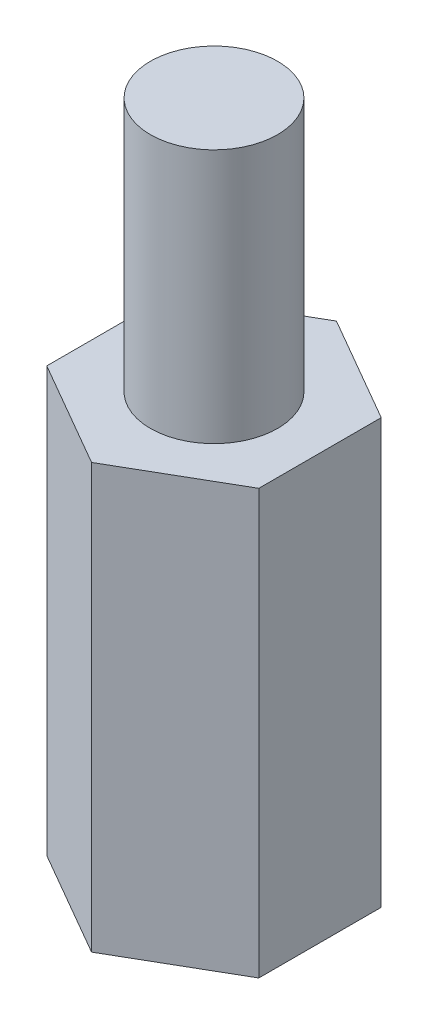
ISO-10303-21;
HEADER;
FILE_DESCRIPTION(('STEP AP214'),'2;1');
FILE_NAME('part.step','',(''),(''),'','','');
FILE_SCHEMA(('AUTOMOTIVE_DESIGN { 1 0 10303 214 1 1 1 1 }'));
ENDSEC;
DATA;
#1=APPLICATION_CONTEXT('core data for automotive mechanical design processes');
#2=APPLICATION_PROTOCOL_DEFINITION('international standard','automotive_design',2000,#1);
#3=PRODUCT_CONTEXT('',#1,'mechanical');
#4=PRODUCT('Part','Part','',(#3));
#5=PRODUCT_RELATED_PRODUCT_CATEGORY('part','',(#4));
#6=PRODUCT_DEFINITION_FORMATION('','',#4);
#7=PRODUCT_DEFINITION_CONTEXT('part definition',#1,'design');
#8=PRODUCT_DEFINITION('design','',#6,#7);
#9=PRODUCT_DEFINITION_SHAPE('','',#8);
#10=(LENGTH_UNIT() NAMED_UNIT(*) SI_UNIT(.MILLI.,.METRE.));
#11=(NAMED_UNIT(*) PLANE_ANGLE_UNIT() SI_UNIT($,.RADIAN.));
#12=(NAMED_UNIT(*) SI_UNIT($,.STERADIAN.) SOLID_ANGLE_UNIT());
#13=UNCERTAINTY_MEASURE_WITH_UNIT(LENGTH_MEASURE(1.E-05),#10,'distance_accuracy_value','');
#14=(GEOMETRIC_REPRESENTATION_CONTEXT(3) GLOBAL_UNCERTAINTY_ASSIGNED_CONTEXT((#13)) GLOBAL_UNIT_ASSIGNED_CONTEXT((#10,
#11,#12)) REPRESENTATION_CONTEXT('',''));
#15=CARTESIAN_POINT('',(0.,0.,0.));
#16=DIRECTION('',(0.,0.,1.));
#17=DIRECTION('',(1.,0.,0.));
#18=AXIS2_PLACEMENT_3D('',#15,#16,#17);
#19=CARTESIAN_POINT('',(0.,10.,2.88675134594813));
#20=DIRECTION('',(-0.500000000000001,0.,-0.866025403784438));
#21=DIRECTION('',(-0.866025403784438,0.,0.500000000000001));
#22=AXIS2_PLACEMENT_3D('',#19,#20,#21);
#23=PLANE('',#22);
#24=DIRECTION('',(0.866025403784438,0.,-0.500000000000001));
#25=VECTOR('',#24,1.);
#26=CARTESIAN_POINT('',(0.,0.,2.88675134594813));
#27=LINE('',#26,#25);
#28=CARTESIAN_POINT('',(0.,0.,2.88675134594813));
#29=VERTEX_POINT('',#28);
#30=CARTESIAN_POINT('',(2.5,0.,1.44337567297406));
#31=VERTEX_POINT('',#30);
#32=EDGE_CURVE('E119',#29,#31,#27,.T.);
#33=ORIENTED_EDGE('',*,*,#32,.T.);
#34=DIRECTION('',(0.,-1.,0.));
#35=VECTOR('',#34,1.);
#36=CARTESIAN_POINT('',(2.5,10.,1.44337567297406));
#37=LINE('',#36,#35);
#38=CARTESIAN_POINT('',(2.5,10.,1.44337567297406));
#39=VERTEX_POINT('',#38);
#40=EDGE_CURVE('E36',#39,#31,#37,.T.);
#41=ORIENTED_EDGE('',*,*,#40,.F.);
#42=DIRECTION('',(0.866025403784438,0.,-0.500000000000001));
#43=VECTOR('',#42,1.);
#44=CARTESIAN_POINT('',(0.,10.,2.88675134594813));
#45=LINE('',#44,#43);
#46=CARTESIAN_POINT('',(0.,10.,2.88675134594813));
#47=VERTEX_POINT('',#46);
#48=EDGE_CURVE('E130',#47,#39,#45,.T.);
#49=ORIENTED_EDGE('',*,*,#48,.F.);
#50=DIRECTION('',(0.,-1.,0.));
#51=VECTOR('',#50,1.);
#52=CARTESIAN_POINT('',(0.,10.,2.88675134594813));
#53=LINE('',#52,#51);
#54=EDGE_CURVE('E115',#47,#29,#53,.T.);
#55=ORIENTED_EDGE('',*,*,#54,.T.);
#56=EDGE_LOOP('',(#33,#41,#49,#55));
#57=FACE_BOUND('',#56,.T.);
#58=ADVANCED_FACE('F33',(#57),#23,.F.);
#59=CARTESIAN_POINT('',(2.5,10.,1.44337567297406));
#60=DIRECTION('',(-1.,0.,0.));
#61=DIRECTION('',(0.,0.,1.));
#62=AXIS2_PLACEMENT_3D('',#59,#60,#61);
#63=PLANE('',#62);
#64=DIRECTION('',(0.,0.,-1.));
#65=VECTOR('',#64,1.);
#66=CARTESIAN_POINT('',(2.5,0.,1.44337567297406));
#67=LINE('',#66,#65);
#68=CARTESIAN_POINT('',(2.5,0.,-1.44337567297406));
#69=VERTEX_POINT('',#68);
#70=EDGE_CURVE('E122',#31,#69,#67,.T.);
#71=ORIENTED_EDGE('',*,*,#70,.T.);
#72=DIRECTION('',(0.,-1.,0.));
#73=VECTOR('',#72,1.);
#74=CARTESIAN_POINT('',(2.5,10.,-1.44337567297406));
#75=LINE('',#74,#73);
#76=CARTESIAN_POINT('',(2.5,10.,-1.44337567297406));
#77=VERTEX_POINT('',#76);
#78=EDGE_CURVE('E133',#77,#69,#75,.T.);
#79=ORIENTED_EDGE('',*,*,#78,.F.);
#80=DIRECTION('',(0.,0.,-1.));
#81=VECTOR('',#80,1.);
#82=CARTESIAN_POINT('',(2.5,10.,1.44337567297406));
#83=LINE('',#82,#81);
#84=EDGE_CURVE('E88',#39,#77,#83,.T.);
#85=ORIENTED_EDGE('',*,*,#84,.F.);
#86=ORIENTED_EDGE('',*,*,#40,.T.);
#87=EDGE_LOOP('',(#71,#79,#85,#86));
#88=FACE_BOUND('',#87,.T.);
#89=ADVANCED_FACE('F138',(#88),#63,.F.);
#90=CARTESIAN_POINT('',(2.5,10.,-1.44337567297406));
#91=DIRECTION('',(-0.5,0.,0.866025403784439));
#92=DIRECTION('',(0.866025403784439,0.,0.5));
#93=AXIS2_PLACEMENT_3D('',#90,#91,#92);
#94=PLANE('',#93);
#95=DIRECTION('',(-0.866025403784439,0.,-0.5));
#96=VECTOR('',#95,1.);
#97=CARTESIAN_POINT('',(2.5,0.,-1.44337567297406));
#98=LINE('',#97,#96);
#99=CARTESIAN_POINT('',(0.,0.,-2.88675134594813));
#100=VERTEX_POINT('',#99);
#101=EDGE_CURVE('E125',#69,#100,#98,.T.);
#102=ORIENTED_EDGE('',*,*,#101,.T.);
#103=DIRECTION('',(0.,-1.,0.));
#104=VECTOR('',#103,1.);
#105=CARTESIAN_POINT('',(0.,10.,-2.88675134594813));
#106=LINE('',#105,#104);
#107=CARTESIAN_POINT('',(0.,10.,-2.88675134594813));
#108=VERTEX_POINT('',#107);
#109=EDGE_CURVE('E110',#108,#100,#106,.T.);
#110=ORIENTED_EDGE('',*,*,#109,.F.);
#111=DIRECTION('',(-0.866025403784439,0.,-0.5));
#112=VECTOR('',#111,1.);
#113=CARTESIAN_POINT('',(2.5,10.,-1.44337567297406));
#114=LINE('',#113,#112);
#115=EDGE_CURVE('E101',#77,#108,#114,.T.);
#116=ORIENTED_EDGE('',*,*,#115,.F.);
#117=ORIENTED_EDGE('',*,*,#78,.T.);
#118=EDGE_LOOP('',(#102,#110,#116,#117));
#119=FACE_BOUND('',#118,.T.);
#120=ADVANCED_FACE('F144',(#119),#94,.F.);
#121=CARTESIAN_POINT('',(0.,10.,-2.88675134594813));
#122=DIRECTION('',(0.5,0.,0.866025403784439));
#123=DIRECTION('',(0.866025403784439,0.,-0.5));
#124=AXIS2_PLACEMENT_3D('',#121,#122,#123);
#125=PLANE('',#124);
#126=DIRECTION('',(-0.866025403784439,0.,0.5));
#127=VECTOR('',#126,1.);
#128=CARTESIAN_POINT('',(0.,0.,-2.88675134594813));
#129=LINE('',#128,#127);
#130=CARTESIAN_POINT('',(-2.5,0.,-1.44337567297406));
#131=VERTEX_POINT('',#130);
#132=EDGE_CURVE('E109',#100,#131,#129,.T.);
#133=ORIENTED_EDGE('',*,*,#132,.T.);
#134=DIRECTION('',(0.,-1.,0.));
#135=VECTOR('',#134,1.);
#136=CARTESIAN_POINT('',(-2.5,10.,-1.44337567297406));
#137=LINE('',#136,#135);
#138=CARTESIAN_POINT('',(-2.5,10.,-1.44337567297406));
#139=VERTEX_POINT('',#138);
#140=EDGE_CURVE('E106',#139,#131,#137,.T.);
#141=ORIENTED_EDGE('',*,*,#140,.F.);
#142=DIRECTION('',(-0.866025403784439,0.,0.5));
#143=VECTOR('',#142,1.);
#144=CARTESIAN_POINT('',(0.,10.,-2.88675134594813));
#145=LINE('',#144,#143);
#146=EDGE_CURVE('E95',#108,#139,#145,.T.);
#147=ORIENTED_EDGE('',*,*,#146,.F.);
#148=ORIENTED_EDGE('',*,*,#109,.T.);
#149=EDGE_LOOP('',(#133,#141,#147,#148));
#150=FACE_BOUND('',#149,.T.);
#151=ADVANCED_FACE('F107',(#150),#125,.F.);
#152=CARTESIAN_POINT('',(-2.5,10.,-1.44337567297406));
#153=DIRECTION('',(1.,0.,0.));
#154=DIRECTION('',(0.,0.,-1.));
#155=AXIS2_PLACEMENT_3D('',#152,#153,#154);
#156=PLANE('',#155);
#157=DIRECTION('',(0.,0.,1.));
#158=VECTOR('',#157,1.);
#159=CARTESIAN_POINT('',(-2.5,0.,-1.44337567297406));
#160=LINE('',#159,#158);
#161=CARTESIAN_POINT('',(-2.5,0.,1.44337567297406));
#162=VERTEX_POINT('',#161);
#163=EDGE_CURVE('E73',#131,#162,#160,.T.);
#164=ORIENTED_EDGE('',*,*,#163,.T.);
#165=DIRECTION('',(0.,-1.,0.));
#166=VECTOR('',#165,1.);
#167=CARTESIAN_POINT('',(-2.5,10.,1.44337567297406));
#168=LINE('',#167,#166);
#169=CARTESIAN_POINT('',(-2.5,10.,1.44337567297406));
#170=VERTEX_POINT('',#169);
#171=EDGE_CURVE('E111',#170,#162,#168,.T.);
#172=ORIENTED_EDGE('',*,*,#171,.F.);
#173=DIRECTION('',(0.,0.,1.));
#174=VECTOR('',#173,1.);
#175=CARTESIAN_POINT('',(-2.5,10.,-1.44337567297406));
#176=LINE('',#175,#174);
#177=EDGE_CURVE('E99',#139,#170,#176,.T.);
#178=ORIENTED_EDGE('',*,*,#177,.F.);
#179=ORIENTED_EDGE('',*,*,#140,.T.);
#180=EDGE_LOOP('',(#164,#172,#178,#179));
#181=FACE_BOUND('',#180,.T.);
#182=ADVANCED_FACE('F113',(#181),#156,.F.);
#183=CARTESIAN_POINT('',(-2.5,10.,1.44337567297406));
#184=DIRECTION('',(0.5,0.,-0.866025403784439));
#185=DIRECTION('',(-0.866025403784439,0.,-0.5));
#186=AXIS2_PLACEMENT_3D('',#183,#184,#185);
#187=PLANE('',#186);
#188=DIRECTION('',(0.866025403784439,0.,0.5));
#189=VECTOR('',#188,1.);
#190=CARTESIAN_POINT('',(-2.5,0.,1.44337567297406));
#191=LINE('',#190,#189);
#192=EDGE_CURVE('E79',#162,#29,#191,.T.);
#193=ORIENTED_EDGE('',*,*,#192,.T.);
#194=ORIENTED_EDGE('',*,*,#54,.F.);
#195=DIRECTION('',(0.866025403784439,0.,0.5));
#196=VECTOR('',#195,1.);
#197=CARTESIAN_POINT('',(-2.5,10.,1.44337567297406));
#198=LINE('',#197,#196);
#199=EDGE_CURVE('E50',#170,#47,#198,.T.);
#200=ORIENTED_EDGE('',*,*,#199,.F.);
#201=ORIENTED_EDGE('',*,*,#171,.T.);
#202=EDGE_LOOP('',(#193,#194,#200,#201));
#203=FACE_BOUND('',#202,.T.);
#204=ADVANCED_FACE('F177',(#203),#187,.F.);
#205=CARTESIAN_POINT('',(0.,10.,0.));
#206=DIRECTION('',(0.,1.,0.));
#207=DIRECTION('',(0.,0.,1.));
#208=AXIS2_PLACEMENT_3D('',#205,#206,#207);
#209=PLANE('',#208);
#210=CARTESIAN_POINT('',(0.,10.,0.));
#211=DIRECTION('',(0.,1.,0.));
#212=DIRECTION('',(0.,0.,1.));
#213=AXIS2_PLACEMENT_3D('',#210,#211,#212);
#214=CIRCLE('',#213,1.5);
#215=CARTESIAN_POINT('',(0.,10.,1.5));
#216=VERTEX_POINT('',#215);
#217=EDGE_CURVE('E11',#216,#216,#214,.T.);
#218=ORIENTED_EDGE('',*,*,#217,.F.);
#219=EDGE_LOOP('',(#218));
#220=FACE_BOUND('',#219,.T.);
#221=ORIENTED_EDGE('',*,*,#48,.T.);
#222=ORIENTED_EDGE('',*,*,#84,.T.);
#223=ORIENTED_EDGE('',*,*,#115,.T.);
#224=ORIENTED_EDGE('',*,*,#146,.T.);
#225=ORIENTED_EDGE('',*,*,#177,.T.);
#226=ORIENTED_EDGE('',*,*,#199,.T.);
#227=EDGE_LOOP('',(#221,#222,#223,#224,#225,#226));
#228=FACE_BOUND('',#227,.T.);
#229=ADVANCED_FACE('F97',(#220,#228),#209,.T.);
#230=CARTESIAN_POINT('',(0.,0.,0.));
#231=DIRECTION('',(0.,1.,0.));
#232=DIRECTION('',(0.,0.,1.));
#233=AXIS2_PLACEMENT_3D('',#230,#231,#232);
#234=PLANE('',#233);
#235=CARTESIAN_POINT('',(0.,0.,0.));
#236=DIRECTION('',(0.,-1.,0.));
#237=DIRECTION('',(0.,0.,-1.));
#238=AXIS2_PLACEMENT_3D('',#235,#236,#237);
#239=CIRCLE('',#238,1.35);
#240=CARTESIAN_POINT('',(0.,0.,-1.35));
#241=VERTEX_POINT('',#240);
#242=EDGE_CURVE('E151',#241,#241,#239,.T.);
#243=ORIENTED_EDGE('',*,*,#242,.F.);
#244=EDGE_LOOP('',(#243));
#245=FACE_BOUND('',#244,.T.);
#246=ORIENTED_EDGE('',*,*,#32,.F.);
#247=ORIENTED_EDGE('',*,*,#192,.F.);
#248=ORIENTED_EDGE('',*,*,#163,.F.);
#249=ORIENTED_EDGE('',*,*,#132,.F.);
#250=ORIENTED_EDGE('',*,*,#101,.F.);
#251=ORIENTED_EDGE('',*,*,#70,.F.);
#252=EDGE_LOOP('',(#246,#247,#248,#249,#250,#251));
#253=FACE_BOUND('',#252,.T.);
#254=ADVANCED_FACE('F143',(#245,#253),#234,.F.);
#255=CARTESIAN_POINT('',(0.,16.,0.));
#256=DIRECTION('',(0.,-1.,0.));
#257=DIRECTION('',(0.,0.,-1.));
#258=AXIS2_PLACEMENT_3D('',#255,#256,#257);
#259=CYLINDRICAL_SURFACE('',#258,1.5);
#260=CARTESIAN_POINT('',(0.,16.,0.));
#261=DIRECTION('',(0.,1.,0.));
#262=DIRECTION('',(0.,0.,1.));
#263=AXIS2_PLACEMENT_3D('',#260,#261,#262);
#264=CIRCLE('',#263,1.5);
#265=CARTESIAN_POINT('',(0.,16.,1.5));
#266=VERTEX_POINT('',#265);
#267=EDGE_CURVE('E123',#266,#266,#264,.T.);
#268=ORIENTED_EDGE('',*,*,#267,.F.);
#269=EDGE_LOOP('',(#268));
#270=FACE_BOUND('',#269,.T.);
#271=ORIENTED_EDGE('',*,*,#217,.T.);
#272=EDGE_LOOP('',(#271));
#273=FACE_BOUND('',#272,.T.);
#274=ADVANCED_FACE('F167',(#270,#273),#259,.T.);
#275=CARTESIAN_POINT('',(0.,16.,0.));
#276=DIRECTION('',(0.,1.,0.));
#277=DIRECTION('',(0.,0.,1.));
#278=AXIS2_PLACEMENT_3D('',#275,#276,#277);
#279=PLANE('',#278);
#280=ORIENTED_EDGE('',*,*,#267,.T.);
#281=EDGE_LOOP('',(#280));
#282=FACE_BOUND('',#281,.T.);
#283=ADVANCED_FACE('F162',(#282),#279,.T.);
#284=CARTESIAN_POINT('',(0.,6.,0.));
#285=DIRECTION('',(0.,-1.,0.));
#286=DIRECTION('',(0.,0.,-1.));
#287=AXIS2_PLACEMENT_3D('',#284,#285,#286);
#288=CYLINDRICAL_SURFACE('',#287,1.35);
#289=CARTESIAN_POINT('',(0.,6.,0.));
#290=DIRECTION('',(0.,-1.,0.));
#291=DIRECTION('',(0.,0.,-1.));
#292=AXIS2_PLACEMENT_3D('',#289,#290,#291);
#293=CIRCLE('',#292,1.35);
#294=CARTESIAN_POINT('',(0.,6.,-1.35));
#295=VERTEX_POINT('',#294);
#296=EDGE_CURVE('E150',#295,#295,#293,.T.);
#297=ORIENTED_EDGE('',*,*,#296,.F.);
#298=EDGE_LOOP('',(#297));
#299=FACE_BOUND('',#298,.T.);
#300=ORIENTED_EDGE('',*,*,#242,.T.);
#301=EDGE_LOOP('',(#300));
#302=FACE_BOUND('',#301,.T.);
#303=ADVANCED_FACE('F159',(#299,#302),#288,.F.);
#304=CARTESIAN_POINT('',(0.,6.,0.));
#305=DIRECTION('',(0.,-1.,0.));
#306=DIRECTION('',(0.,0.,-1.));
#307=AXIS2_PLACEMENT_3D('',#304,#305,#306);
#308=PLANE('',#307);
#309=ORIENTED_EDGE('',*,*,#296,.T.);
#310=EDGE_LOOP('',(#309));
#311=FACE_BOUND('',#310,.T.);
#312=ADVANCED_FACE('F157',(#311),#308,.T.);
#313=CLOSED_SHELL('',(#58,#89,#120,#151,#182,#204,#229,#254,#274,#283,#303,#312));
#314=MANIFOLD_SOLID_BREP('B2',#313);
#315=ADVANCED_BREP_SHAPE_REPRESENTATION('',(#18,#314),#14);
#316=SHAPE_DEFINITION_REPRESENTATION(#9,#315);
ENDSEC;
END-ISO-10303-21;
